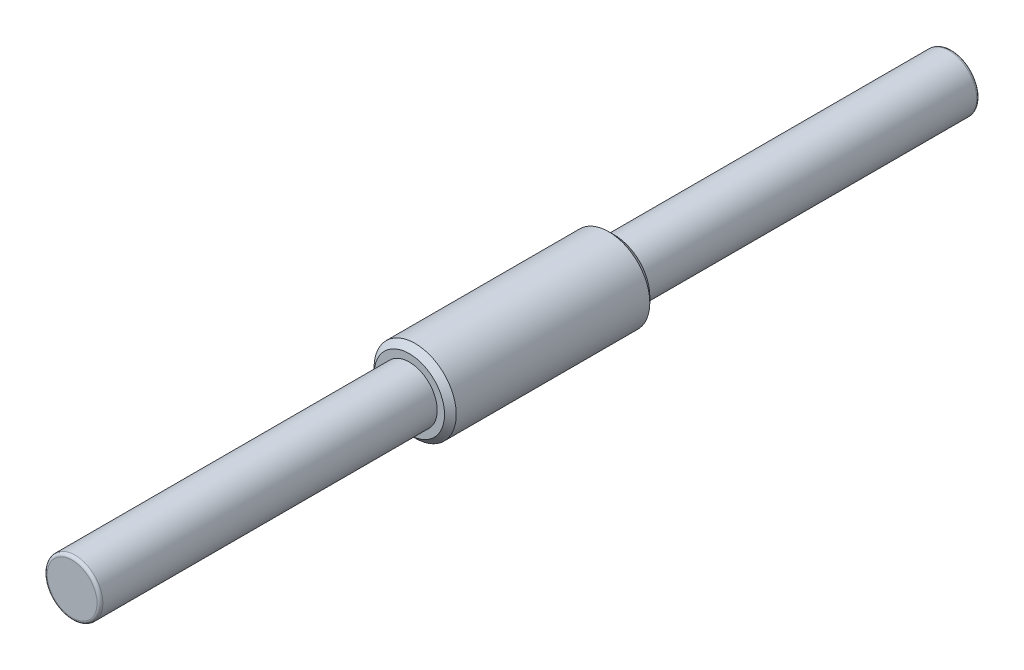
ISO-10303-21;
HEADER;
FILE_DESCRIPTION(('STEP AP214'),'2;1');
FILE_NAME('part.step','',(''),(''),'','','');
FILE_SCHEMA(('AUTOMOTIVE_DESIGN { 1 0 10303 214 1 1 1 1 }'));
ENDSEC;
DATA;
#1=APPLICATION_CONTEXT('core data for automotive mechanical design processes');
#2=APPLICATION_PROTOCOL_DEFINITION('international standard','automotive_design',2000,#1);
#3=PRODUCT_CONTEXT('',#1,'mechanical');
#4=PRODUCT('Part','Part','',(#3));
#5=PRODUCT_RELATED_PRODUCT_CATEGORY('part','',(#4));
#6=PRODUCT_DEFINITION_FORMATION('','',#4);
#7=PRODUCT_DEFINITION_CONTEXT('part definition',#1,'design');
#8=PRODUCT_DEFINITION('design','',#6,#7);
#9=PRODUCT_DEFINITION_SHAPE('','',#8);
#10=(LENGTH_UNIT() NAMED_UNIT(*) SI_UNIT(.MILLI.,.METRE.));
#11=(NAMED_UNIT(*) PLANE_ANGLE_UNIT() SI_UNIT($,.RADIAN.));
#12=(NAMED_UNIT(*) SI_UNIT($,.STERADIAN.) SOLID_ANGLE_UNIT());
#13=UNCERTAINTY_MEASURE_WITH_UNIT(LENGTH_MEASURE(1.E-05),#10,'distance_accuracy_value','');
#14=(GEOMETRIC_REPRESENTATION_CONTEXT(3) GLOBAL_UNCERTAINTY_ASSIGNED_CONTEXT((#13)) GLOBAL_UNIT_ASSIGNED_CONTEXT((#10,
#11,#12)) REPRESENTATION_CONTEXT('',''));
#15=CARTESIAN_POINT('',(0.,0.,0.));
#16=DIRECTION('',(0.,0.,1.));
#17=DIRECTION('',(1.,0.,0.));
#18=AXIS2_PLACEMENT_3D('',#15,#16,#17);
#19=CARTESIAN_POINT('',(0.,0.,-1.75));
#20=DIRECTION('',(0.,0.,1.));
#21=DIRECTION('',(1.,0.,0.));
#22=AXIS2_PLACEMENT_3D('',#19,#20,#21);
#23=CYLINDRICAL_SURFACE('',#22,0.7);
#24=CARTESIAN_POINT('',(0.,0.,-1.65));
#25=DIRECTION('',(0.,0.,1.));
#26=DIRECTION('',(1.,0.,0.));
#27=AXIS2_PLACEMENT_3D('',#24,#25,#26);
#28=CIRCLE('',#27,0.7);
#29=CARTESIAN_POINT('',(0.7,0.,-1.65));
#30=VERTEX_POINT('',#29);
#31=EDGE_CURVE('E55',#30,#30,#28,.T.);
#32=ORIENTED_EDGE('',*,*,#31,.T.);
#33=EDGE_LOOP('',(#32));
#34=FACE_BOUND('',#33,.T.);
#35=CARTESIAN_POINT('',(0.,0.,1.65));
#36=DIRECTION('',(0.,0.,1.));
#37=DIRECTION('',(1.,0.,0.));
#38=AXIS2_PLACEMENT_3D('',#35,#36,#37);
#39=CIRCLE('',#38,0.7);
#40=CARTESIAN_POINT('',(0.7,0.,1.65));
#41=VERTEX_POINT('',#40);
#42=EDGE_CURVE('E59',#41,#41,#39,.F.);
#43=ORIENTED_EDGE('',*,*,#42,.T.);
#44=EDGE_LOOP('',(#43));
#45=FACE_BOUND('',#44,.T.);
#46=ADVANCED_FACE('F43',(#34,#45),#23,.T.);
#47=CARTESIAN_POINT('',(0.,0.,-1.75));
#48=DIRECTION('',(0.,0.,1.));
#49=DIRECTION('',(1.,0.,0.));
#50=AXIS2_PLACEMENT_3D('',#47,#48,#49);
#51=PLANE('',#50);
#52=CARTESIAN_POINT('',(0.,0.,-1.75));
#53=DIRECTION('',(0.,0.,1.));
#54=DIRECTION('',(1.,0.,0.));
#55=AXIS2_PLACEMENT_3D('',#52,#53,#54);
#56=CIRCLE('',#55,0.599999999999999);
#57=CARTESIAN_POINT('',(0.599999999999999,0.,-1.75));
#58=VERTEX_POINT('',#57);
#59=EDGE_CURVE('E51',#58,#58,#56,.F.);
#60=ORIENTED_EDGE('',*,*,#59,.T.);
#61=EDGE_LOOP('',(#60));
#62=FACE_BOUND('',#61,.T.);
#63=ADVANCED_FACE('F75',(#62),#51,.F.);
#64=CARTESIAN_POINT('',(0.,0.,1.75));
#65=DIRECTION('',(0.,0.,1.));
#66=DIRECTION('',(1.,0.,0.));
#67=AXIS2_PLACEMENT_3D('',#64,#65,#66);
#68=PLANE('',#67);
#69=CARTESIAN_POINT('',(0.,0.,1.75));
#70=DIRECTION('',(0.,0.,1.));
#71=DIRECTION('',(1.,0.,0.));
#72=AXIS2_PLACEMENT_3D('',#69,#70,#71);
#73=CIRCLE('',#72,0.599999999999999);
#74=CARTESIAN_POINT('',(0.599999999999999,0.,1.75));
#75=VERTEX_POINT('',#74);
#76=EDGE_CURVE('E11',#75,#75,#73,.T.);
#77=ORIENTED_EDGE('',*,*,#76,.T.);
#78=EDGE_LOOP('',(#77));
#79=FACE_BOUND('',#78,.T.);
#80=ADVANCED_FACE('F72',(#79),#68,.T.);
#81=CARTESIAN_POINT('',(0.,0.,-1.65));
#82=DIRECTION('',(0.,0.,1.));
#83=DIRECTION('',(1.,0.,0.));
#84=AXIS2_PLACEMENT_3D('',#81,#82,#83);
#85=CONICAL_SURFACE('',#84,0.7,0.78539816339745);
#86=ORIENTED_EDGE('',*,*,#59,.F.);
#87=EDGE_LOOP('',(#86));
#88=FACE_BOUND('',#87,.T.);
#89=ORIENTED_EDGE('',*,*,#31,.F.);
#90=EDGE_LOOP('',(#89));
#91=FACE_BOUND('',#90,.T.);
#92=ADVANCED_FACE('F68',(#88,#91),#85,.T.);
#93=CARTESIAN_POINT('',(0.,0.,1.75));
#94=DIRECTION('',(0.,0.,-1.));
#95=DIRECTION('',(-1.,0.,0.));
#96=AXIS2_PLACEMENT_3D('',#93,#94,#95);
#97=CONICAL_SURFACE('',#96,0.599999999999999,0.785398163397448);
#98=ORIENTED_EDGE('',*,*,#42,.F.);
#99=EDGE_LOOP('',(#98));
#100=FACE_BOUND('',#99,.T.);
#101=ORIENTED_EDGE('',*,*,#76,.F.);
#102=EDGE_LOOP('',(#101));
#103=FACE_BOUND('',#102,.T.);
#104=ADVANCED_FACE('F46',(#100,#103),#97,.T.);
#105=CLOSED_SHELL('',(#46,#63,#80,#92,#104));
#106=MANIFOLD_SOLID_BREP('B2',#105);
#107=CARTESIAN_POINT('',(0.,0.,7.5));
#108=DIRECTION('',(0.,0.,-1.));
#109=DIRECTION('',(-1.,0.,0.));
#110=AXIS2_PLACEMENT_3D('',#107,#108,#109);
#111=CYLINDRICAL_SURFACE('',#110,0.475);
#112=CARTESIAN_POINT('',(0.,0.,7.45));
#113=DIRECTION('',(0.,0.,1.));
#114=DIRECTION('',(1.,0.,0.));
#115=AXIS2_PLACEMENT_3D('',#112,#113,#114);
#116=CIRCLE('',#115,0.475);
#117=CARTESIAN_POINT('',(0.475,0.,7.45));
#118=VERTEX_POINT('',#117);
#119=EDGE_CURVE('E127',#118,#118,#116,.F.);
#120=ORIENTED_EDGE('',*,*,#119,.T.);
#121=EDGE_LOOP('',(#120));
#122=FACE_BOUND('',#121,.T.);
#123=CARTESIAN_POINT('',(0.,0.,-7.45));
#124=DIRECTION('',(0.,0.,1.));
#125=DIRECTION('',(1.,0.,0.));
#126=AXIS2_PLACEMENT_3D('',#123,#124,#125);
#127=CIRCLE('',#126,0.475);
#128=CARTESIAN_POINT('',(0.475,0.,-7.45));
#129=VERTEX_POINT('',#128);
#130=EDGE_CURVE('E131',#129,#129,#127,.T.);
#131=ORIENTED_EDGE('',*,*,#130,.T.);
#132=EDGE_LOOP('',(#131));
#133=FACE_BOUND('',#132,.T.);
#134=ADVANCED_FACE('F120',(#122,#133),#111,.T.);
#135=CARTESIAN_POINT('',(0.,0.,7.5));
#136=DIRECTION('',(0.,0.,1.));
#137=DIRECTION('',(1.,0.,0.));
#138=AXIS2_PLACEMENT_3D('',#135,#136,#137);
#139=PLANE('',#138);
#140=CARTESIAN_POINT('',(0.,0.,7.5));
#141=DIRECTION('',(0.,0.,1.));
#142=DIRECTION('',(1.,0.,0.));
#143=AXIS2_PLACEMENT_3D('',#140,#141,#142);
#144=CIRCLE('',#143,0.425);
#145=CARTESIAN_POINT('',(0.425,0.,7.5));
#146=VERTEX_POINT('',#145);
#147=EDGE_CURVE('E135',#146,#146,#144,.T.);
#148=ORIENTED_EDGE('',*,*,#147,.T.);
#149=EDGE_LOOP('',(#148));
#150=FACE_BOUND('',#149,.T.);
#151=ADVANCED_FACE('F141',(#150),#139,.T.);
#152=CARTESIAN_POINT('',(0.,0.,-7.5));
#153=DIRECTION('',(0.,0.,1.));
#154=DIRECTION('',(1.,0.,0.));
#155=AXIS2_PLACEMENT_3D('',#152,#153,#154);
#156=PLANE('',#155);
#157=CARTESIAN_POINT('',(0.,0.,-7.5));
#158=DIRECTION('',(0.,0.,1.));
#159=DIRECTION('',(1.,0.,0.));
#160=AXIS2_PLACEMENT_3D('',#157,#158,#159);
#161=CIRCLE('',#160,0.425);
#162=CARTESIAN_POINT('',(0.425,0.,-7.5));
#163=VERTEX_POINT('',#162);
#164=EDGE_CURVE('E42',#163,#163,#161,.F.);
#165=ORIENTED_EDGE('',*,*,#164,.T.);
#166=EDGE_LOOP('',(#165));
#167=FACE_BOUND('',#166,.T.);
#168=ADVANCED_FACE('F145',(#167),#156,.F.);
#169=CARTESIAN_POINT('',(0.,0.,7.45));
#170=DIRECTION('',(0.,0.,1.));
#171=DIRECTION('',(1.,0.,0.));
#172=AXIS2_PLACEMENT_3D('',#169,#170,#171);
#173=TOROIDAL_SURFACE('',#172,0.425,0.05);
#174=ORIENTED_EDGE('',*,*,#119,.F.);
#175=EDGE_LOOP('',(#174));
#176=FACE_BOUND('',#175,.T.);
#177=ORIENTED_EDGE('',*,*,#147,.F.);
#178=EDGE_LOOP('',(#177));
#179=FACE_BOUND('',#178,.T.);
#180=ADVANCED_FACE('F143',(#176,#179),#173,.T.);
#181=CARTESIAN_POINT('',(0.,0.,-7.45));
#182=DIRECTION('',(0.,0.,1.));
#183=DIRECTION('',(1.,0.,0.));
#184=AXIS2_PLACEMENT_3D('',#181,#182,#183);
#185=TOROIDAL_SURFACE('',#184,0.425,0.05);
#186=ORIENTED_EDGE('',*,*,#164,.F.);
#187=EDGE_LOOP('',(#186));
#188=FACE_BOUND('',#187,.T.);
#189=ORIENTED_EDGE('',*,*,#130,.F.);
#190=EDGE_LOOP('',(#189));
#191=FACE_BOUND('',#190,.T.);
#192=ADVANCED_FACE('F122',(#188,#191),#185,.T.);
#193=CLOSED_SHELL('',(#134,#151,#168,#180,#192));
#194=MANIFOLD_SOLID_BREP('B6',#193);
#195=ADVANCED_BREP_SHAPE_REPRESENTATION('',(#18,#106,#194),#14);
#196=SHAPE_DEFINITION_REPRESENTATION(#9,#195);
ENDSEC;
END-ISO-10303-21;
